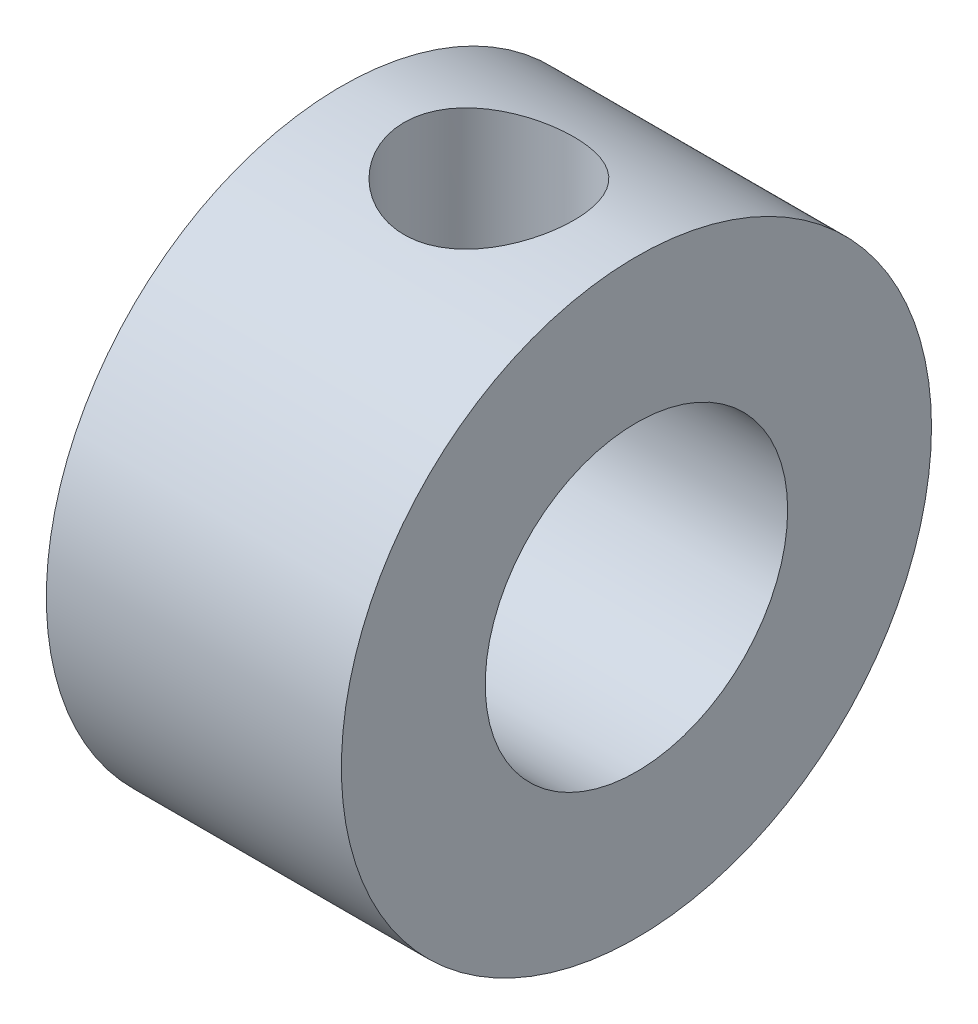
ISO-10303-21;
HEADER;
FILE_DESCRIPTION(('STEP AP214'),'2;1');
FILE_NAME('part.step','',(''),(''),'','','');
FILE_SCHEMA(('AUTOMOTIVE_DESIGN { 1 0 10303 214 1 1 1 1 }'));
ENDSEC;
DATA;
#1=APPLICATION_CONTEXT('core data for automotive mechanical design processes');
#2=APPLICATION_PROTOCOL_DEFINITION('international standard','automotive_design',2000,#1);
#3=PRODUCT_CONTEXT('',#1,'mechanical');
#4=PRODUCT('Part','Part','',(#3));
#5=PRODUCT_RELATED_PRODUCT_CATEGORY('part','',(#4));
#6=PRODUCT_DEFINITION_FORMATION('','',#4);
#7=PRODUCT_DEFINITION_CONTEXT('part definition',#1,'design');
#8=PRODUCT_DEFINITION('design','',#6,#7);
#9=PRODUCT_DEFINITION_SHAPE('','',#8);
#10=(LENGTH_UNIT() NAMED_UNIT(*) SI_UNIT(.MILLI.,.METRE.));
#11=(NAMED_UNIT(*) PLANE_ANGLE_UNIT() SI_UNIT($,.RADIAN.));
#12=(NAMED_UNIT(*) SI_UNIT($,.STERADIAN.) SOLID_ANGLE_UNIT());
#13=UNCERTAINTY_MEASURE_WITH_UNIT(LENGTH_MEASURE(1.E-05),#10,'distance_accuracy_value','');
#14=(GEOMETRIC_REPRESENTATION_CONTEXT(3) GLOBAL_UNCERTAINTY_ASSIGNED_CONTEXT((#13)) GLOBAL_UNIT_ASSIGNED_CONTEXT((#10,
#11,#12)) REPRESENTATION_CONTEXT('',''));
#15=CARTESIAN_POINT('',(0.,0.,0.));
#16=DIRECTION('',(0.,0.,1.));
#17=DIRECTION('',(1.,0.,0.));
#18=AXIS2_PLACEMENT_3D('',#15,#16,#17);
#19=CARTESIAN_POINT('',(4.,0.,0.));
#20=DIRECTION('',(-1.,0.,0.));
#21=DIRECTION('',(0.,0.,1.));
#22=AXIS2_PLACEMENT_3D('',#19,#20,#21);
#23=CYLINDRICAL_SURFACE('',#22,4.);
#24=CARTESIAN_POINT('',(4.,0.,0.));
#25=DIRECTION('',(1.,0.,0.));
#26=DIRECTION('',(0.,0.,-1.));
#27=AXIS2_PLACEMENT_3D('',#24,#25,#26);
#28=CIRCLE('',#27,4.);
#29=CARTESIAN_POINT('',(4.,0.,-4.));
#30=VERTEX_POINT('',#29);
#31=EDGE_CURVE('E10',#30,#30,#28,.T.);
#32=ORIENTED_EDGE('',*,*,#31,.F.);
#33=EDGE_LOOP('',(#32));
#34=FACE_BOUND('',#33,.T.);
#35=CARTESIAN_POINT('',(0.,0.,0.));
#36=DIRECTION('',(1.,0.,0.));
#37=DIRECTION('',(0.,0.,-1.));
#38=AXIS2_PLACEMENT_3D('',#35,#36,#37);
#39=CIRCLE('',#38,4.);
#40=CARTESIAN_POINT('',(0.,0.,-4.));
#41=VERTEX_POINT('',#40);
#42=EDGE_CURVE('E52',#41,#41,#39,.T.);
#43=ORIENTED_EDGE('',*,*,#42,.T.);
#44=EDGE_LOOP('',(#43));
#45=FACE_BOUND('',#44,.T.);
#46=CARTESIAN_POINT('',(2.,3.8311225508981,-1.15));
#47=CARTESIAN_POINT('',(1.93685354763671,3.83112340964317,-1.14999890286406));
#48=CARTESIAN_POINT('',(1.87369604653529,3.83270084822929,-1.14478124061924));
#49=CARTESIAN_POINT('',(1.74921880863793,3.83881746310754,-1.12409663092199));
#50=CARTESIAN_POINT('',(1.6878998128995,3.84335781733012,-1.10862560712677));
#51=CARTESIAN_POINT('',(1.56891896779639,3.85484446176411,-1.06799601426112));
#52=CARTESIAN_POINT('',(1.51125156750833,3.86178699115659,-1.04285258136921));
#53=CARTESIAN_POINT('',(1.40094121549271,3.87729076660456,-0.98364080847928));
#54=CARTESIAN_POINT('',(1.34829888084604,3.88585221107993,-0.949571374281972));
#55=CARTESIAN_POINT('',(1.24800305821177,3.90390814573648,-0.872415024035858));
#56=CARTESIAN_POINT('',(1.20051723044332,3.91342125572836,-0.829114475167629));
#57=CARTESIAN_POINT('',(1.11337131483704,3.93214894899,-0.735183502331389));
#58=CARTESIAN_POINT('',(1.07371215402091,3.94136349678895,-0.684552211310804));
#59=CARTESIAN_POINT('',(1.00262855922055,3.95866590262896,-0.576215949414217));
#60=CARTESIAN_POINT('',(0.971373421207407,3.96672925152583,-0.518395640950636));
#61=CARTESIAN_POINT('',(0.919093708888433,3.98060545462988,-0.398049159182933));
#62=CARTESIAN_POINT('',(0.898067116622923,3.98641875269668,-0.335523916914257));
#63=CARTESIAN_POINT('',(0.867391458196383,3.99500814231366,-0.209294991167583));
#64=CARTESIAN_POINT('',(0.857456582628479,3.99786039038309,-0.145666038638779));
#65=CARTESIAN_POINT('',(0.848344395080341,4.0004737583295,-0.0175848320500584));
#66=CARTESIAN_POINT('',(0.849165001900126,4.00023547622824,0.0468672603199095));
#67=CARTESIAN_POINT('',(0.861344976754292,3.99674923024243,0.172766235945063));
#68=CARTESIAN_POINT('',(0.872395126649587,3.99358957689918,0.234245860137745));
#69=CARTESIAN_POINT('',(0.904217567151593,3.98472171772738,0.354438169496335));
#70=CARTESIAN_POINT('',(0.924990452505507,3.97901335599337,0.413150685154223));
#71=CARTESIAN_POINT('',(0.975888612315331,3.96556395691974,0.526898134896318));
#72=CARTESIAN_POINT('',(1.00611447226775,3.9578012031085,0.581885386897297));
#73=CARTESIAN_POINT('',(1.07498199129164,3.94107155087826,0.686108784487039));
#74=CARTESIAN_POINT('',(1.11362551367083,3.93210438602331,0.735343653032858));
#75=CARTESIAN_POINT('',(1.19985012239459,3.91355444674496,0.828510696738088));
#76=CARTESIAN_POINT('',(1.24769991013597,3.90396111945719,0.872192409849846));
#77=CARTESIAN_POINT('',(1.35014190982722,3.88552201891993,0.95097857450415));
#78=CARTESIAN_POINT('',(1.40473468260804,3.87667630795475,0.986082311870782));
#79=CARTESIAN_POINT('',(1.51972677993943,3.86068648758374,1.04694919554569));
#80=CARTESIAN_POINT('',(1.58016991201733,3.85355687521471,1.07263366186639));
#81=CARTESIAN_POINT('',(1.7047745792295,3.84198107806402,1.11338912418289));
#82=CARTESIAN_POINT('',(1.76893501052477,3.8375341011141,1.12846325357551));
#83=CARTESIAN_POINT('',(1.89678504548647,3.83199900488056,1.14711623400675));
#84=CARTESIAN_POINT('',(1.96041477483418,3.83080049038822,1.15107307118508));
#85=CARTESIAN_POINT('',(2.08742899506654,3.83159398209268,1.14842926061369));
#86=CARTESIAN_POINT('',(2.15081351597334,3.8335855844615,1.14182994913745));
#87=CARTESIAN_POINT('',(2.27400892985881,3.84042720462372,1.11859655436896));
#88=CARTESIAN_POINT('',(2.33386865703835,3.84520963741638,1.1021995229819));
#89=CARTESIAN_POINT('',(2.44998546694599,3.85702557654609,1.06010774305035));
#90=CARTESIAN_POINT('',(2.50624202384511,3.86405941054735,1.03441164106748));
#91=CARTESIAN_POINT('',(2.61511001116528,3.87980450974284,0.9737148486598));
#92=CARTESIAN_POINT('',(2.66759512627495,3.88855332007231,0.938497570306178));
#93=CARTESIAN_POINT('',(2.76604914872634,3.90665905071126,0.860019622680388));
#94=CARTESIAN_POINT('',(2.81201662178159,3.91601610421336,0.816757187800463));
#95=CARTESIAN_POINT('',(2.89775091777679,3.93467194402065,0.721650925025256));
#96=CARTESIAN_POINT('',(2.93725142123724,3.94395775643387,0.669563919241542));
#97=CARTESIAN_POINT('',(3.00695383710908,3.96109974415377,0.559283473047612));
#98=CARTESIAN_POINT('',(3.03715623339532,3.96895599384641,0.501090350611989));
#99=CARTESIAN_POINT('',(3.08711614590499,3.9823038526595,0.3806506157329));
#100=CARTESIAN_POINT('',(3.10695267050574,3.98781328768444,0.318438850780514));
#101=CARTESIAN_POINT('',(3.13583241025023,3.99592549314845,0.191379825669701));
#102=CARTESIAN_POINT('',(3.14487843977111,3.99852902149476,0.126533257285527));
#103=CARTESIAN_POINT('',(3.15172074840701,4.00049390219356,-0.00148349558937832));
#104=CARTESIAN_POINT('',(3.14990485811465,3.99996703170404,-0.0646315061498073));
#105=CARTESIAN_POINT('',(3.13599167465084,3.99598963142203,-0.189685307154462));
#106=CARTESIAN_POINT('',(3.12389488463335,3.99253924470837,-0.251591158239018));
#107=CARTESIAN_POINT('',(3.08999586262566,3.98313076932668,-0.371857366581871));
#108=CARTESIAN_POINT('',(3.0682834691471,3.97719592043062,-0.430244987286031));
#109=CARTESIAN_POINT('',(3.0158495223448,3.96343442782092,-0.542580626211518));
#110=CARTESIAN_POINT('',(2.98512656289235,3.95560748887388,-0.596527949825763));
#111=CARTESIAN_POINT('',(2.9144716965877,3.93859751687491,-0.700210226688834));
#112=CARTESIAN_POINT('',(2.87429100539303,3.92938082519791,-0.749770087716305));
#113=CARTESIAN_POINT('',(2.78631839616156,3.91074822899389,-0.84157412903663));
#114=CARTESIAN_POINT('',(2.7385243645712,3.90133226977913,-0.883816271026107));
#115=CARTESIAN_POINT('',(2.63514895353306,3.8830737328542,-0.960912561345868));
#116=CARTESIAN_POINT('',(2.57939375471937,3.87425317061476,-0.995539393225433));
#117=CARTESIAN_POINT('',(2.46260717564617,3.85851903227254,-1.05488350609618));
#118=CARTESIAN_POINT('',(2.40157872089631,3.85160440759845,-1.07960623933802));
#119=CARTESIAN_POINT('',(2.284130424163,3.84125801193029,-1.11581508804506));
#120=CARTESIAN_POINT('',(2.22813801740635,3.83749105236257,-1.12860121974884));
#121=CARTESIAN_POINT('',(2.11476663088778,3.83242313216644,-1.1456934846681));
#122=CARTESIAN_POINT('',(2.05738787817743,3.83112177046539,-1.15000099708378));
#123=CARTESIAN_POINT('',(2.,3.8311225508981,-1.15));
#124=B_SPLINE_CURVE_WITH_KNOTS('',3,(#46,#47,#48,#49,#50,#51,#52,#53,#54,#55,#56,#57,#58,#59,
#60,#61,#62,#63,#64,#65,#66,#67,#68,#69,#70,#71,#72,#73,#74,#75,#76,#77,#78,#79,#80,#81,#82,#83,
#84,#85,#86,#87,#88,#89,#90,#91,#92,#93,#94,#95,#96,#97,#98,#99,#100,#101,#102,#103,#104,#105,
#106,#107,#108,#109,#110,#111,#112,#113,#114,#115,#116,#117,#118,#119,#120,#121,#122,#123),
.UNSPECIFIED.,.T.,.F.,(4,2,2,2,2,2,2,2,2,2,2,2,2,2,2,2,2,2,2,2,2,2,2,2,2,2,2,2,2,2,2,2,2,2,2,2,
2,2,4),(0.,0.189227930907147,0.378531136737258,0.567539302607267,0.756570649007801,
0.950574527960001,1.14460137173343,1.34228521426902,1.53993004050829,1.73235516813842,
1.9247430618032,2.11149893393056,2.29826623155154,2.48709264626916,2.67596090156999,
2.87153758994763,3.06713055589602,3.26432199425326,3.46145517446465,3.65179968398441,
3.84212010022938,4.02801232563787,4.21393161772203,4.40449966366975,4.59510958156287,
4.79224838850887,4.98937693458781,5.18498021232715,5.38053246165302,5.56914510017873,
5.75774850841006,5.94462579753225,6.13153226500683,6.32405015408942,6.51662158186276,
6.71433352890713,6.9119364845766,7.08393595483978,7.25590744397729),.UNSPECIFIED.);
#125=CARTESIAN_POINT('',(2.,3.8311225508981,-1.15));
#126=VERTEX_POINT('',#125);
#127=EDGE_CURVE('E62',#126,#126,#124,.T.);
#128=ORIENTED_EDGE('',*,*,#127,.F.);
#129=EDGE_LOOP('',(#128));
#130=FACE_BOUND('',#129,.T.);
#131=ADVANCED_FACE('F39',(#34,#45,#130),#23,.T.);
#132=CARTESIAN_POINT('',(4.,0.,0.));
#133=DIRECTION('',(-1.,0.,0.));
#134=DIRECTION('',(0.,0.,1.));
#135=AXIS2_PLACEMENT_3D('',#132,#133,#134);
#136=CYLINDRICAL_SURFACE('',#135,2.05);
#137=CARTESIAN_POINT('',(0.,0.,0.));
#138=DIRECTION('',(1.,0.,0.));
#139=DIRECTION('',(0.,0.,-1.));
#140=AXIS2_PLACEMENT_3D('',#137,#138,#139);
#141=CIRCLE('',#140,2.05);
#142=CARTESIAN_POINT('',(0.,0.,-2.05));
#143=VERTEX_POINT('',#142);
#144=EDGE_CURVE('E59',#143,#143,#141,.T.);
#145=ORIENTED_EDGE('',*,*,#144,.F.);
#146=EDGE_LOOP('',(#145));
#147=FACE_BOUND('',#146,.T.);
#148=CARTESIAN_POINT('',(4.,0.,0.));
#149=DIRECTION('',(1.,0.,0.));
#150=DIRECTION('',(0.,0.,-1.));
#151=AXIS2_PLACEMENT_3D('',#148,#149,#150);
#152=CIRCLE('',#151,2.05);
#153=CARTESIAN_POINT('',(4.,0.,-2.05));
#154=VERTEX_POINT('',#153);
#155=EDGE_CURVE('E57',#154,#154,#152,.T.);
#156=ORIENTED_EDGE('',*,*,#155,.T.);
#157=EDGE_LOOP('',(#156));
#158=FACE_BOUND('',#157,.T.);
#159=CARTESIAN_POINT('',(2.,1.69705627484771,-1.15));
#160=CARTESIAN_POINT('',(1.94129438356802,1.6970624880797,-1.14999564702138));
#161=CARTESIAN_POINT('',(1.88254310715686,1.70015106596374,-1.14547327244497));
#162=CARTESIAN_POINT('',(1.7669425174062,1.71201250885136,-1.12766106413834));
#163=CARTESIAN_POINT('',(1.71009641075039,1.72079449647584,-1.11435715903108));
#164=CARTESIAN_POINT('',(1.60021462710972,1.74268220105462,-1.07980082104911));
#165=CARTESIAN_POINT('',(1.54715690252982,1.75575990188233,-1.05859977540172));
#166=CARTESIAN_POINT('',(1.44537437442105,1.78471933691939,-1.00900917572843));
#167=CARTESIAN_POINT('',(1.3966505907023,1.80060172848349,-0.98061793580828));
#168=CARTESIAN_POINT('',(1.29926636656007,1.83541414022458,-0.913953869010103));
#169=CARTESIAN_POINT('',(1.25115478350315,1.85448891413931,-0.874954586435434));
#170=CARTESIAN_POINT('',(1.16171149680913,1.89237556785007,-0.789679474992624));
#171=CARTESIAN_POINT('',(1.12038403668124,1.91118727641891,-0.743399126946989));
#172=CARTESIAN_POINT('',(1.04200081376574,1.94845265569292,-0.639786132152402));
#173=CARTESIAN_POINT('',(1.00566873102811,1.96672029662526,-0.581832617411318));
#174=CARTESIAN_POINT('',(0.943526532999074,1.99885659298406,-0.459416609051559));
#175=CARTESIAN_POINT('',(0.917708076883134,2.01272873356695,-0.394959325956798));
#176=CARTESIAN_POINT('',(0.879667582718345,2.03344869122356,-0.26722025560149));
#177=CARTESIAN_POINT('',(0.866468555082077,2.04079731830407,-0.204312643381361));
#178=CARTESIAN_POINT('',(0.850773562056218,2.04955517955347,-0.0767860254296741));
#179=CARTESIAN_POINT('',(0.848269077959394,2.05096914094753,-0.0121684230871633));
#180=CARTESIAN_POINT('',(0.853775975849345,2.04788387190783,0.109382159877591));
#181=CARTESIAN_POINT('',(0.860672743243612,2.04401133498122,0.166386233983205));
#182=CARTESIAN_POINT('',(0.882719212627691,2.03180513107343,0.278271089420266));
#183=CARTESIAN_POINT('',(0.897869553174418,2.02347111892069,0.333151706113579));
#184=CARTESIAN_POINT('',(0.935965419500699,2.00297531906259,0.43997793223306));
#185=CARTESIAN_POINT('',(0.958986210307583,1.99077665962795,0.491889332693291));
#186=CARTESIAN_POINT('',(1.01199832206679,1.96357584973049,0.591206339074108));
#187=CARTESIAN_POINT('',(1.04199179187566,1.94857283529486,0.638610549599762));
#188=CARTESIAN_POINT('',(1.11186692503817,1.91513354442632,0.733176758759305));
#189=CARTESIAN_POINT('',(1.1524752502845,1.89650107436562,0.779732371670096));
#190=CARTESIAN_POINT('',(1.24052999720241,1.85881943618141,0.865736520742103));
#191=CARTESIAN_POINT('',(1.28798383668199,1.83976983529616,0.905177241494928));
#192=CARTESIAN_POINT('',(1.39371715909677,1.80136911223642,0.979529881143581));
#193=CARTESIAN_POINT('',(1.45259424064614,1.78215676068861,1.01367199991398));
#194=CARTESIAN_POINT('',(1.57649047320567,1.74809485138957,1.07135162943855));
#195=CARTESIAN_POINT('',(1.64150240234391,1.73324024637613,1.09490142551251));
#196=CARTESIAN_POINT('',(1.7705152936666,1.71142128457187,1.12867868425706));
#197=CARTESIAN_POINT('',(1.8341809350375,1.70392070588057,1.13982133883333));
#198=CARTESIAN_POINT('',(1.96288481085475,1.69625315108246,1.15120849951411));
#199=CARTESIAN_POINT('',(2.02792118545418,1.69607680683639,1.15146692720967));
#200=CARTESIAN_POINT('',(2.14671822307158,1.70251246933845,1.14191399921296));
#201=CARTESIAN_POINT('',(2.20067184125675,1.70808240562249,1.13364851723981));
#202=CARTESIAN_POINT('',(2.30626386393811,1.72367863039757,1.10978995788437));
#203=CARTESIAN_POINT('',(2.35790115413647,1.73370703890952,1.09419339434193));
#204=CARTESIAN_POINT('',(2.45984082023526,1.75752448422568,1.0555282025131));
#205=CARTESIAN_POINT('',(2.51000571870781,1.77144868886116,1.03218398748378));
#206=CARTESIAN_POINT('',(2.60600708278444,1.80143314102508,0.97891407824455));
#207=CARTESIAN_POINT('',(2.65184145264269,1.81749441381786,0.948985220501962));
#208=CARTESIAN_POINT('',(2.74586565712778,1.85313767918436,0.877622712881301));
#209=CARTESIAN_POINT('',(2.79318202289167,1.87286132045472,0.83510380902948));
#210=CARTESIAN_POINT('',(2.88037414032436,1.91142067712035,0.742619161158904));
#211=CARTESIAN_POINT('',(2.92024506010763,1.93025581001446,0.692648618802897));
#212=CARTESIAN_POINT('',(2.99355071516464,1.96623120551655,0.583046727882353));
#213=CARTESIAN_POINT('',(3.02648829503963,1.98321340195493,0.523026796400879));
#214=CARTESIAN_POINT('',(3.08144877767633,2.01220881716875,0.397082612422691));
#215=CARTESIAN_POINT('',(3.10348336045599,2.02422735105783,0.331164767976678));
#216=CARTESIAN_POINT('',(3.1337268403111,2.04088115644326,0.202634898170324));
#217=CARTESIAN_POINT('',(3.14313094328662,2.04615200191517,0.140387169775928));
#218=CARTESIAN_POINT('',(3.15161517430905,2.05090300708391,0.0149842018440178));
#219=CARTESIAN_POINT('',(3.15070124703672,2.05038650113517,-0.0481704942016657));
#220=CARTESIAN_POINT('',(3.13920038671129,2.04395698731936,-0.167200754906837));
#221=CARTESIAN_POINT('',(3.12954034980961,2.0385611481187,-0.223198003727471));
#222=CARTESIAN_POINT('',(3.10228704780423,2.02358773305606,-0.332631527257575));
#223=CARTESIAN_POINT('',(3.08469287156711,2.01400967692449,-0.386067507058478));
#224=CARTESIAN_POINT('',(3.04158942280301,1.99112154436458,-0.490817220345324));
#225=CARTESIAN_POINT('',(3.01584840694862,1.9777034702954,-0.542011181499051));
#226=CARTESIAN_POINT('',(2.95747677902041,1.94836482900645,-0.639508057918361));
#227=CARTESIAN_POINT('',(2.9248435250219,1.93244330276602,-0.685809087390631));
#228=CARTESIAN_POINT('',(2.84922096201096,1.89734656752222,-0.778000766780754));
#229=CARTESIAN_POINT('',(2.80546471904108,1.87800898487209,-0.823201252417234));
#230=CARTESIAN_POINT('',(2.71108868907741,1.83950822981913,-0.905979411758754));
#231=CARTESIAN_POINT('',(2.66046018487662,1.82034531246222,-0.94354725012656));
#232=CARTESIAN_POINT('',(2.54912014818708,1.78285741535676,-1.0127088728912));
#233=CARTESIAN_POINT('',(2.48793731491788,1.76470286231054,-1.04364394101569));
#234=CARTESIAN_POINT('',(2.35994808405288,1.733712402557,-1.09436694187736));
#235=CARTESIAN_POINT('',(2.29315990699386,1.7208600095534,-1.11418949741706));
#236=CARTESIAN_POINT('',(2.18791800502721,1.70703591256708,-1.13516514729922));
#237=CARTESIAN_POINT('',(2.15065525970715,1.70331860023657,-1.14071278967438));
#238=CARTESIAN_POINT('',(2.07560129156363,1.69832688917764,-1.14813145429018));
#239=CARTESIAN_POINT('',(2.03781011605329,1.69705227313482,-1.15000280359251));
#240=CARTESIAN_POINT('',(2.,1.69705627484771,-1.15));
#241=B_SPLINE_CURVE_WITH_KNOTS('',3,(#159,#160,#161,#162,#163,#164,#165,#166,#167,#168,#169,
#170,#171,#172,#173,#174,#175,#176,#177,#178,#179,#180,#181,#182,#183,#184,#185,#186,#187,#188,
#189,#190,#191,#192,#193,#194,#195,#196,#197,#198,#199,#200,#201,#202,#203,#204,#205,#206,#207,
#208,#209,#210,#211,#212,#213,#214,#215,#216,#217,#218,#219,#220,#221,#222,#223,#224,#225,#226,
#227,#228,#229,#230,#231,#232,#233,#234,#235,#236,#237,#238,#239,#240),.UNSPECIFIED.,.T.,.F.,(4,
2,2,2,2,2,2,2,2,2,2,2,2,2,2,2,2,2,2,2,2,2,2,2,2,2,2,2,2,2,2,2,2,2,2,2,2,2,2,2,4),(0.,
0.175955814078276,0.352194263488616,0.527305400675769,0.702457634475017,0.896086172617103,
1.0898353688213,1.3010959284331,1.51218855965848,1.70515831574231,1.89797433362767,
2.06980935731413,2.24165767730589,2.41519761158884,2.58879109888085,2.7815796842524,
2.97457876707111,3.1856484883998,3.39647276892704,3.59042837235334,3.78413588717068,
3.94798809206262,4.11191829278614,4.28244941467649,4.45306264633017,4.6520170886497,
4.85110020148241,5.06154468614177,5.27176323789298,5.4602176479992,5.64856348659707,
5.81902197156439,5.9895000364741,6.16534504527498,6.34125758151356,6.5378818818782,
6.73475796505144,6.94638861290095,7.15735617408452,7.27069288888315,7.38401952021594),.UNSPECIFIED.);
#242=CARTESIAN_POINT('',(2.,1.69705627484771,-1.15));
#243=VERTEX_POINT('',#242);
#244=EDGE_CURVE('E43',#243,#243,#241,.T.);
#245=ORIENTED_EDGE('',*,*,#244,.T.);
#246=EDGE_LOOP('',(#245));
#247=FACE_BOUND('',#246,.T.);
#248=ADVANCED_FACE('F74',(#147,#158,#247),#136,.F.);
#249=CARTESIAN_POINT('',(4.,0.,0.));
#250=DIRECTION('',(1.,0.,0.));
#251=DIRECTION('',(0.,0.,-1.));
#252=AXIS2_PLACEMENT_3D('',#249,#250,#251);
#253=PLANE('',#252);
#254=ORIENTED_EDGE('',*,*,#31,.T.);
#255=EDGE_LOOP('',(#254));
#256=FACE_BOUND('',#255,.T.);
#257=ORIENTED_EDGE('',*,*,#155,.F.);
#258=EDGE_LOOP('',(#257));
#259=FACE_BOUND('',#258,.T.);
#260=ADVANCED_FACE('F79',(#256,#259),#253,.T.);
#261=CARTESIAN_POINT('',(0.,0.,0.));
#262=DIRECTION('',(1.,0.,0.));
#263=DIRECTION('',(0.,0.,-1.));
#264=AXIS2_PLACEMENT_3D('',#261,#262,#263);
#265=PLANE('',#264);
#266=ORIENTED_EDGE('',*,*,#42,.F.);
#267=EDGE_LOOP('',(#266));
#268=FACE_BOUND('',#267,.T.);
#269=ORIENTED_EDGE('',*,*,#144,.T.);
#270=EDGE_LOOP('',(#269));
#271=FACE_BOUND('',#270,.T.);
#272=ADVANCED_FACE('F72',(#268,#271),#265,.F.);
#273=CARTESIAN_POINT('',(2.,5.,0.));
#274=DIRECTION('',(0.,-1.,0.));
#275=DIRECTION('',(0.,0.,-1.));
#276=AXIS2_PLACEMENT_3D('',#273,#274,#275);
#277=CYLINDRICAL_SURFACE('',#276,1.15);
#278=ORIENTED_EDGE('',*,*,#244,.F.);
#279=EDGE_LOOP('',(#278));
#280=FACE_BOUND('',#279,.T.);
#281=ORIENTED_EDGE('',*,*,#127,.T.);
#282=EDGE_LOOP('',(#281));
#283=FACE_BOUND('',#282,.T.);
#284=ADVANCED_FACE('F69',(#280,#283),#277,.F.);
#285=CLOSED_SHELL('',(#131,#248,#260,#272,#284));
#286=MANIFOLD_SOLID_BREP('B2',#285);
#287=ADVANCED_BREP_SHAPE_REPRESENTATION('',(#18,#286),#14);
#288=SHAPE_DEFINITION_REPRESENTATION(#9,#287);
ENDSEC;
END-ISO-10303-21;
